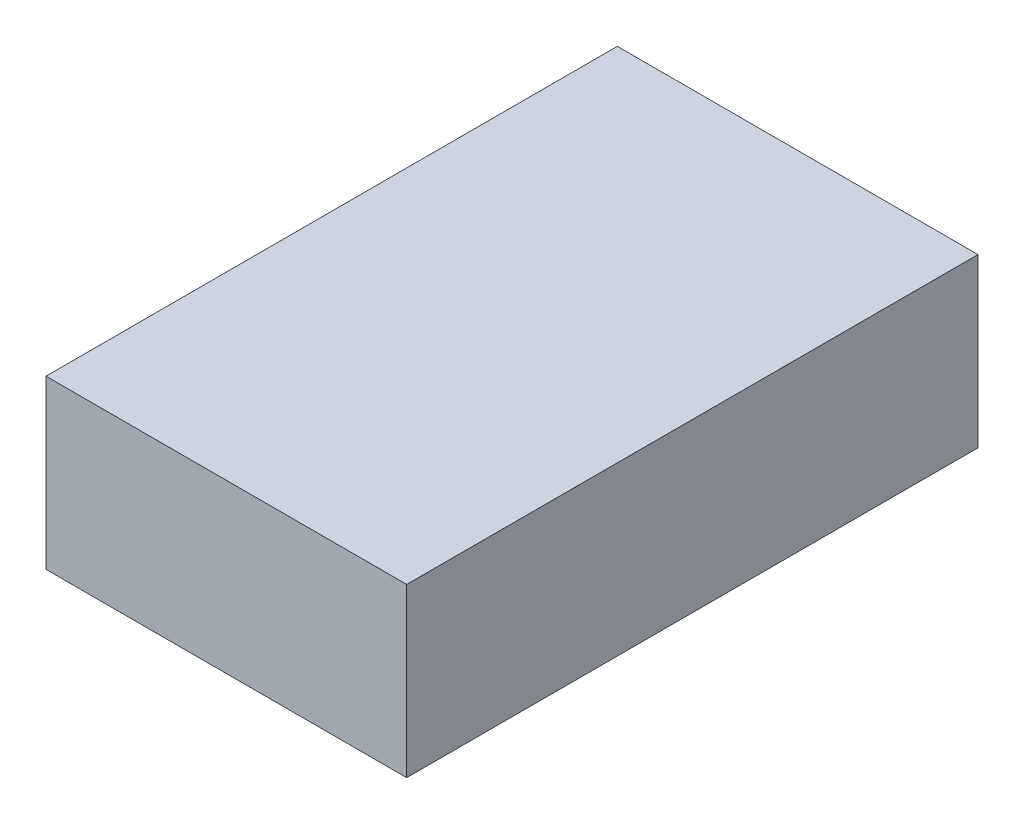
ISO-10303-21;
HEADER;
FILE_DESCRIPTION(('STEP AP214'),'2;1');
FILE_NAME('part.step','',(''),(''),'','','');
FILE_SCHEMA(('AUTOMOTIVE_DESIGN { 1 0 10303 214 1 1 1 1 }'));
ENDSEC;
DATA;
#1=APPLICATION_CONTEXT('core data for automotive mechanical design processes');
#2=APPLICATION_PROTOCOL_DEFINITION('international standard','automotive_design',2000,#1);
#3=PRODUCT_CONTEXT('',#1,'mechanical');
#4=PRODUCT('Part','Part','',(#3));
#5=PRODUCT_RELATED_PRODUCT_CATEGORY('part','',(#4));
#6=PRODUCT_DEFINITION_FORMATION('','',#4);
#7=PRODUCT_DEFINITION_CONTEXT('part definition',#1,'design');
#8=PRODUCT_DEFINITION('design','',#6,#7);
#9=PRODUCT_DEFINITION_SHAPE('','',#8);
#10=(LENGTH_UNIT() NAMED_UNIT(*) SI_UNIT(.MILLI.,.METRE.));
#11=(NAMED_UNIT(*) PLANE_ANGLE_UNIT() SI_UNIT($,.RADIAN.));
#12=(NAMED_UNIT(*) SI_UNIT($,.STERADIAN.) SOLID_ANGLE_UNIT());
#13=UNCERTAINTY_MEASURE_WITH_UNIT(LENGTH_MEASURE(1.E-05),#10,'distance_accuracy_value','');
#14=(GEOMETRIC_REPRESENTATION_CONTEXT(3) GLOBAL_UNCERTAINTY_ASSIGNED_CONTEXT((#13)) GLOBAL_UNIT_ASSIGNED_CONTEXT((#10,
#11,#12)) REPRESENTATION_CONTEXT('',''));
#15=CARTESIAN_POINT('',(0.,0.,0.));
#16=DIRECTION('',(0.,0.,1.));
#17=DIRECTION('',(1.,0.,0.));
#18=AXIS2_PLACEMENT_3D('',#15,#16,#17);
#19=CARTESIAN_POINT('',(2.68820139588941,0.29,-0.99));
#20=DIRECTION('',(0.,0.,1.));
#21=DIRECTION('',(1.,0.,0.));
#22=AXIS2_PLACEMENT_3D('',#19,#20,#21);
#23=PLANE('',#22);
#24=DIRECTION('',(0.,1.,0.));
#25=VECTOR('',#24,1.);
#26=CARTESIAN_POINT('',(0.625000000094658,-3.72531450132385E-11,-0.99));
#27=LINE('',#26,#25);
#28=CARTESIAN_POINT('',(0.625000000094658,-0.29,-0.990000000447035));
#29=VERTEX_POINT('',#28);
#30=CARTESIAN_POINT('',(0.625000000094658,0.29,-0.99));
#31=VERTEX_POINT('',#30);
#32=EDGE_CURVE('E11',#29,#31,#27,.T.);
#33=ORIENTED_EDGE('',*,*,#32,.F.);
#34=DIRECTION('',(-1.,0.,0.));
#35=VECTOR('',#34,1.);
#36=CARTESIAN_POINT('',(9.46580591687507E-11,-0.29,-0.990000000447035));
#37=LINE('',#36,#35);
#38=CARTESIAN_POINT('',(-0.624999999905342,-0.29,-0.990000000447035));
#39=VERTEX_POINT('',#38);
#40=EDGE_CURVE('E24',#29,#39,#37,.T.);
#41=ORIENTED_EDGE('',*,*,#40,.T.);
#42=DIRECTION('',(0.,-1.,0.));
#43=VECTOR('',#42,1.);
#44=CARTESIAN_POINT('',(-0.624999999905342,-3.72531450132385E-11,-0.99));
#45=LINE('',#44,#43);
#46=CARTESIAN_POINT('',(-0.624999999905342,0.29,-0.99));
#47=VERTEX_POINT('',#46);
#48=EDGE_CURVE('E85',#47,#39,#45,.T.);
#49=ORIENTED_EDGE('',*,*,#48,.F.);
#50=DIRECTION('',(-1.,0.,0.));
#51=VECTOR('',#50,1.);
#52=CARTESIAN_POINT('',(9.46580591687507E-11,0.29,-0.99));
#53=LINE('',#52,#51);
#54=EDGE_CURVE('E83',#31,#47,#53,.T.);
#55=ORIENTED_EDGE('',*,*,#54,.F.);
#56=EDGE_LOOP('',(#33,#41,#49,#55));
#57=FACE_BOUND('',#56,.T.);
#58=ADVANCED_FACE('F17',(#57),#23,.F.);
#59=CARTESIAN_POINT('',(2.68820139588941,-0.29,0.99));
#60=DIRECTION('',(0.,1.,0.));
#61=DIRECTION('',(0.,0.,1.));
#62=AXIS2_PLACEMENT_3D('',#59,#60,#61);
#63=PLANE('',#62);
#64=DIRECTION('',(0.,0.,-1.));
#65=VECTOR('',#64,1.);
#66=CARTESIAN_POINT('',(0.625000000094658,-0.29,-2.23517426789499E-10));
#67=LINE('',#66,#65);
#68=CARTESIAN_POINT('',(0.625000000094658,-0.290000000074506,0.99));
#69=VERTEX_POINT('',#68);
#70=EDGE_CURVE('E81',#69,#29,#67,.T.);
#71=ORIENTED_EDGE('',*,*,#70,.F.);
#72=DIRECTION('',(-1.,0.,0.));
#73=VECTOR('',#72,1.);
#74=CARTESIAN_POINT('',(9.46580591687507E-11,-0.290000000074506,0.99));
#75=LINE('',#74,#73);
#76=CARTESIAN_POINT('',(-0.624999999905342,-0.290000000074506,0.99));
#77=VERTEX_POINT('',#76);
#78=EDGE_CURVE('E71',#69,#77,#75,.T.);
#79=ORIENTED_EDGE('',*,*,#78,.T.);
#80=DIRECTION('',(0.,0.,1.));
#81=VECTOR('',#80,1.);
#82=CARTESIAN_POINT('',(-0.624999999905342,-0.29,-2.23517426789499E-10));
#83=LINE('',#82,#81);
#84=EDGE_CURVE('E77',#39,#77,#83,.T.);
#85=ORIENTED_EDGE('',*,*,#84,.F.);
#86=ORIENTED_EDGE('',*,*,#40,.F.);
#87=EDGE_LOOP('',(#71,#79,#85,#86));
#88=FACE_BOUND('',#87,.T.);
#89=ADVANCED_FACE('F91',(#88),#63,.F.);
#90=CARTESIAN_POINT('',(-0.625,0.3,1.));
#91=DIRECTION('',(1.,0.,0.));
#92=DIRECTION('',(0.,0.,-1.));
#93=AXIS2_PLACEMENT_3D('',#90,#91,#92);
#94=PLANE('',#93);
#95=DIRECTION('',(0.,1.,0.));
#96=VECTOR('',#95,1.);
#97=CARTESIAN_POINT('',(-0.624999999905342,-3.72531450132385E-11,0.99));
#98=LINE('',#97,#96);
#99=CARTESIAN_POINT('',(-0.624999999905342,0.29,0.99));
#100=VERTEX_POINT('',#99);
#101=EDGE_CURVE('E75',#77,#100,#98,.T.);
#102=ORIENTED_EDGE('',*,*,#101,.T.);
#103=DIRECTION('',(0.,0.,-1.));
#104=VECTOR('',#103,1.);
#105=CARTESIAN_POINT('',(-0.624999999905342,0.29,-2.23517426789499E-10));
#106=LINE('',#105,#104);
#107=EDGE_CURVE('E59',#100,#47,#106,.T.);
#108=ORIENTED_EDGE('',*,*,#107,.T.);
#109=ORIENTED_EDGE('',*,*,#48,.T.);
#110=ORIENTED_EDGE('',*,*,#84,.T.);
#111=EDGE_LOOP('',(#102,#108,#109,#110));
#112=FACE_BOUND('',#111,.T.);
#113=ADVANCED_FACE('F90',(#112),#94,.F.);
#114=CARTESIAN_POINT('',(2.68820139588941,0.29,0.99));
#115=DIRECTION('',(0.,-1.,0.));
#116=DIRECTION('',(0.,0.,-1.));
#117=AXIS2_PLACEMENT_3D('',#114,#115,#116);
#118=PLANE('',#117);
#119=DIRECTION('',(0.,0.,1.));
#120=VECTOR('',#119,1.);
#121=CARTESIAN_POINT('',(0.625000000094658,0.29,-2.23517426789499E-10));
#122=LINE('',#121,#120);
#123=CARTESIAN_POINT('',(0.625000000094658,0.29,0.99));
#124=VERTEX_POINT('',#123);
#125=EDGE_CURVE('E52',#31,#124,#122,.T.);
#126=ORIENTED_EDGE('',*,*,#125,.F.);
#127=ORIENTED_EDGE('',*,*,#54,.T.);
#128=ORIENTED_EDGE('',*,*,#107,.F.);
#129=DIRECTION('',(-1.,0.,0.));
#130=VECTOR('',#129,1.);
#131=CARTESIAN_POINT('',(9.46580591687507E-11,0.29,0.99));
#132=LINE('',#131,#130);
#133=EDGE_CURVE('E60',#124,#100,#132,.T.);
#134=ORIENTED_EDGE('',*,*,#133,.F.);
#135=EDGE_LOOP('',(#126,#127,#128,#134));
#136=FACE_BOUND('',#135,.T.);
#137=ADVANCED_FACE('F64',(#136),#118,.F.);
#138=CARTESIAN_POINT('',(0.625,0.3,1.));
#139=DIRECTION('',(1.,0.,0.));
#140=DIRECTION('',(0.,0.,-1.));
#141=AXIS2_PLACEMENT_3D('',#138,#139,#140);
#142=PLANE('',#141);
#143=ORIENTED_EDGE('',*,*,#125,.T.);
#144=DIRECTION('',(0.,-1.,0.));
#145=VECTOR('',#144,1.);
#146=CARTESIAN_POINT('',(0.625000000094658,-3.72531450132385E-11,0.99));
#147=LINE('',#146,#145);
#148=EDGE_CURVE('E56',#124,#69,#147,.T.);
#149=ORIENTED_EDGE('',*,*,#148,.T.);
#150=ORIENTED_EDGE('',*,*,#70,.T.);
#151=ORIENTED_EDGE('',*,*,#32,.T.);
#152=EDGE_LOOP('',(#143,#149,#150,#151));
#153=FACE_BOUND('',#152,.T.);
#154=ADVANCED_FACE('F54',(#153),#142,.T.);
#155=CARTESIAN_POINT('',(2.68820139588941,0.29,0.99));
#156=DIRECTION('',(0.,0.,-1.));
#157=DIRECTION('',(-1.,0.,0.));
#158=AXIS2_PLACEMENT_3D('',#155,#156,#157);
#159=PLANE('',#158);
#160=ORIENTED_EDGE('',*,*,#148,.F.);
#161=ORIENTED_EDGE('',*,*,#133,.T.);
#162=ORIENTED_EDGE('',*,*,#101,.F.);
#163=ORIENTED_EDGE('',*,*,#78,.F.);
#164=EDGE_LOOP('',(#160,#161,#162,#163));
#165=FACE_BOUND('',#164,.T.);
#166=ADVANCED_FACE('F70',(#165),#159,.F.);
#167=CLOSED_SHELL('',(#58,#89,#113,#137,#154,#166));
#168=MANIFOLD_SOLID_BREP('B1',#167);
#169=ADVANCED_BREP_SHAPE_REPRESENTATION('',(#18,#168),#14);
#170=SHAPE_DEFINITION_REPRESENTATION(#9,#169);
ENDSEC;
END-ISO-10303-21;
